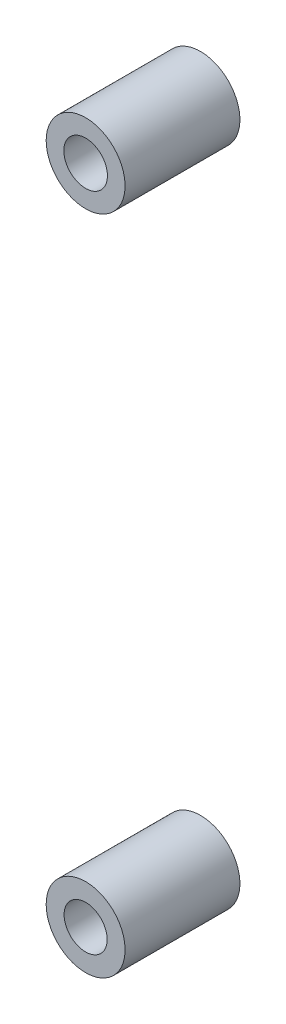
ISO-10303-21;
HEADER;
FILE_DESCRIPTION(('STEP AP214'),'2;1');
FILE_NAME('part.step','',(''),(''),'','','');
FILE_SCHEMA(('AUTOMOTIVE_DESIGN { 1 0 10303 214 1 1 1 1 }'));
ENDSEC;
DATA;
#1=APPLICATION_CONTEXT('core data for automotive mechanical design processes');
#2=APPLICATION_PROTOCOL_DEFINITION('international standard','automotive_design',2000,#1);
#3=PRODUCT_CONTEXT('',#1,'mechanical');
#4=PRODUCT('Part','Part','',(#3));
#5=PRODUCT_RELATED_PRODUCT_CATEGORY('part','',(#4));
#6=PRODUCT_DEFINITION_FORMATION('','',#4);
#7=PRODUCT_DEFINITION_CONTEXT('part definition',#1,'design');
#8=PRODUCT_DEFINITION('design','',#6,#7);
#9=PRODUCT_DEFINITION_SHAPE('','',#8);
#10=(LENGTH_UNIT() NAMED_UNIT(*) SI_UNIT(.MILLI.,.METRE.));
#11=(NAMED_UNIT(*) PLANE_ANGLE_UNIT() SI_UNIT($,.RADIAN.));
#12=(NAMED_UNIT(*) SI_UNIT($,.STERADIAN.) SOLID_ANGLE_UNIT());
#13=UNCERTAINTY_MEASURE_WITH_UNIT(LENGTH_MEASURE(1.E-05),#10,'distance_accuracy_value','');
#14=(GEOMETRIC_REPRESENTATION_CONTEXT(3) GLOBAL_UNCERTAINTY_ASSIGNED_CONTEXT((#13)) GLOBAL_UNIT_ASSIGNED_CONTEXT((#10,
#11,#12)) REPRESENTATION_CONTEXT('',''));
#15=CARTESIAN_POINT('',(0.,0.,0.));
#16=DIRECTION('',(0.,0.,1.));
#17=DIRECTION('',(1.,0.,0.));
#18=AXIS2_PLACEMENT_3D('',#15,#16,#17);
#19=CARTESIAN_POINT('',(-24.6984901117111,-24.5621520758186,-49.8004157799882));
#20=DIRECTION('',(0.,0.,-1.));
#21=DIRECTION('',(-1.,0.,0.));
#22=AXIS2_PLACEMENT_3D('',#19,#20,#21);
#23=PLANE('',#22);
#24=CARTESIAN_POINT('',(-24.6984901117111,-24.5621520758186,-49.8004157799882));
#25=DIRECTION('',(0.,0.,-1.));
#26=DIRECTION('',(-1.,0.,0.));
#27=AXIS2_PLACEMENT_3D('',#24,#25,#26);
#28=CIRCLE('',#27,2.75);
#29=CARTESIAN_POINT('',(-27.4484901117111,-24.5621520758186,-49.8004157799882));
#30=VERTEX_POINT('',#29);
#31=EDGE_CURVE('E11',#30,#30,#28,.T.);
#32=ORIENTED_EDGE('',*,*,#31,.T.);
#33=EDGE_LOOP('',(#32));
#34=FACE_BOUND('',#33,.T.);
#35=CARTESIAN_POINT('',(-24.6984901117111,-24.5621520758186,-49.8004157799882));
#36=DIRECTION('',(0.,0.,-1.));
#37=DIRECTION('',(-1.,0.,0.));
#38=AXIS2_PLACEMENT_3D('',#35,#36,#37);
#39=CIRCLE('',#38,1.49999999999862);
#40=CARTESIAN_POINT('',(-26.1984901117097,-24.5621520758186,-49.8004157799882));
#41=VERTEX_POINT('',#40);
#42=EDGE_CURVE('E56',#41,#41,#39,.T.);
#43=ORIENTED_EDGE('',*,*,#42,.F.);
#44=EDGE_LOOP('',(#43));
#45=FACE_BOUND('',#44,.T.);
#46=ADVANCED_FACE('F42',(#34,#45),#23,.T.);
#47=CARTESIAN_POINT('',(-24.6984901117111,-24.5621520758186,-41.8004157799882));
#48=DIRECTION('',(0.,0.,-1.));
#49=DIRECTION('',(-1.,0.,0.));
#50=AXIS2_PLACEMENT_3D('',#47,#48,#49);
#51=PLANE('',#50);
#52=CARTESIAN_POINT('',(-24.6984901117111,-24.5621520758186,-41.8004157799882));
#53=DIRECTION('',(0.,0.,-1.));
#54=DIRECTION('',(-1.,0.,0.));
#55=AXIS2_PLACEMENT_3D('',#52,#53,#54);
#56=CIRCLE('',#55,2.75);
#57=CARTESIAN_POINT('',(-27.4484901117111,-24.5621520758186,-41.8004157799882));
#58=VERTEX_POINT('',#57);
#59=EDGE_CURVE('E46',#58,#58,#56,.T.);
#60=ORIENTED_EDGE('',*,*,#59,.F.);
#61=EDGE_LOOP('',(#60));
#62=FACE_BOUND('',#61,.T.);
#63=CARTESIAN_POINT('',(-24.6984901117111,-24.5621520758186,-41.8004157799882));
#64=DIRECTION('',(0.,0.,-1.));
#65=DIRECTION('',(-1.,0.,0.));
#66=AXIS2_PLACEMENT_3D('',#63,#64,#65);
#67=CIRCLE('',#66,1.49999999999862);
#68=CARTESIAN_POINT('',(-26.1984901117097,-24.5621520758186,-41.8004157799882));
#69=VERTEX_POINT('',#68);
#70=EDGE_CURVE('E58',#69,#69,#67,.T.);
#71=ORIENTED_EDGE('',*,*,#70,.T.);
#72=EDGE_LOOP('',(#71));
#73=FACE_BOUND('',#72,.T.);
#74=ADVANCED_FACE('F69',(#62,#73),#51,.F.);
#75=CARTESIAN_POINT('',(-24.6984901117111,-24.5621520758186,-49.8004157799882));
#76=DIRECTION('',(0.,0.,1.));
#77=DIRECTION('',(1.,0.,0.));
#78=AXIS2_PLACEMENT_3D('',#75,#76,#77);
#79=CYLINDRICAL_SURFACE('',#78,2.75);
#80=ORIENTED_EDGE('',*,*,#31,.F.);
#81=EDGE_LOOP('',(#80));
#82=FACE_BOUND('',#81,.T.);
#83=ORIENTED_EDGE('',*,*,#59,.T.);
#84=EDGE_LOOP('',(#83));
#85=FACE_BOUND('',#84,.T.);
#86=ADVANCED_FACE('F44',(#82,#85),#79,.T.);
#87=CARTESIAN_POINT('',(-24.6984901117111,-24.5621520758186,-49.8004157799882));
#88=DIRECTION('',(0.,0.,1.));
#89=DIRECTION('',(1.,0.,0.));
#90=AXIS2_PLACEMENT_3D('',#87,#88,#89);
#91=CYLINDRICAL_SURFACE('',#90,1.49999999999862);
#92=ORIENTED_EDGE('',*,*,#42,.T.);
#93=EDGE_LOOP('',(#92));
#94=FACE_BOUND('',#93,.T.);
#95=ORIENTED_EDGE('',*,*,#70,.F.);
#96=EDGE_LOOP('',(#95));
#97=FACE_BOUND('',#96,.T.);
#98=ADVANCED_FACE('F65',(#94,#97),#91,.F.);
#99=CLOSED_SHELL('',(#46,#74,#86,#98));
#100=MANIFOLD_SOLID_BREP('B2',#99);
#101=CARTESIAN_POINT('',(-24.6984901117111,21.5378471641813,-49.8004157799882));
#102=DIRECTION('',(0.,0.,-1.));
#103=DIRECTION('',(-1.,0.,0.));
#104=AXIS2_PLACEMENT_3D('',#101,#102,#103);
#105=PLANE('',#104);
#106=CARTESIAN_POINT('',(-24.6984901117111,21.5378471641813,-49.8004157799882));
#107=DIRECTION('',(0.,0.,-1.));
#108=DIRECTION('',(-1.,0.,0.));
#109=AXIS2_PLACEMENT_3D('',#106,#107,#108);
#110=CIRCLE('',#109,2.75000000000041);
#111=CARTESIAN_POINT('',(-27.4484901117115,21.5378471641813,-49.8004157799882));
#112=VERTEX_POINT('',#111);
#113=EDGE_CURVE('E41',#112,#112,#110,.T.);
#114=ORIENTED_EDGE('',*,*,#113,.T.);
#115=EDGE_LOOP('',(#114));
#116=FACE_BOUND('',#115,.T.);
#117=CARTESIAN_POINT('',(-24.6984901117111,21.5378471641813,-49.8004157799882));
#118=DIRECTION('',(0.,0.,-1.));
#119=DIRECTION('',(-1.,0.,0.));
#120=AXIS2_PLACEMENT_3D('',#117,#118,#119);
#121=CIRCLE('',#120,1.52);
#122=CARTESIAN_POINT('',(-26.2184901117111,21.5378471641813,-49.8004157799882));
#123=VERTEX_POINT('',#122);
#124=EDGE_CURVE('E126',#123,#123,#121,.T.);
#125=ORIENTED_EDGE('',*,*,#124,.F.);
#126=EDGE_LOOP('',(#125));
#127=FACE_BOUND('',#126,.T.);
#128=ADVANCED_FACE('F111',(#116,#127),#105,.T.);
#129=CARTESIAN_POINT('',(-24.6984901117111,21.5378471641813,-41.8004157799882));
#130=DIRECTION('',(0.,0.,-1.));
#131=DIRECTION('',(-1.,0.,0.));
#132=AXIS2_PLACEMENT_3D('',#129,#130,#131);
#133=PLANE('',#132);
#134=CARTESIAN_POINT('',(-24.6984901117111,21.5378471641813,-41.8004157799882));
#135=DIRECTION('',(0.,0.,-1.));
#136=DIRECTION('',(-1.,0.,0.));
#137=AXIS2_PLACEMENT_3D('',#134,#135,#136);
#138=CIRCLE('',#137,2.75000000000041);
#139=CARTESIAN_POINT('',(-27.4484901117115,21.5378471641813,-41.8004157799882));
#140=VERTEX_POINT('',#139);
#141=EDGE_CURVE('E115',#140,#140,#138,.T.);
#142=ORIENTED_EDGE('',*,*,#141,.F.);
#143=EDGE_LOOP('',(#142));
#144=FACE_BOUND('',#143,.T.);
#145=CARTESIAN_POINT('',(-24.6984901117111,21.5378471641813,-41.8004157799882));
#146=DIRECTION('',(0.,0.,-1.));
#147=DIRECTION('',(-1.,0.,0.));
#148=AXIS2_PLACEMENT_3D('',#145,#146,#147);
#149=CIRCLE('',#148,1.52);
#150=CARTESIAN_POINT('',(-26.2184901117111,21.5378471641813,-41.8004157799882));
#151=VERTEX_POINT('',#150);
#152=EDGE_CURVE('E128',#151,#151,#149,.T.);
#153=ORIENTED_EDGE('',*,*,#152,.T.);
#154=EDGE_LOOP('',(#153));
#155=FACE_BOUND('',#154,.T.);
#156=ADVANCED_FACE('F138',(#144,#155),#133,.F.);
#157=CARTESIAN_POINT('',(-24.6984901117111,21.5378471641813,-49.8004157799882));
#158=DIRECTION('',(0.,0.,1.));
#159=DIRECTION('',(1.,0.,0.));
#160=AXIS2_PLACEMENT_3D('',#157,#158,#159);
#161=CYLINDRICAL_SURFACE('',#160,2.75000000000041);
#162=ORIENTED_EDGE('',*,*,#113,.F.);
#163=EDGE_LOOP('',(#162));
#164=FACE_BOUND('',#163,.T.);
#165=ORIENTED_EDGE('',*,*,#141,.T.);
#166=EDGE_LOOP('',(#165));
#167=FACE_BOUND('',#166,.T.);
#168=ADVANCED_FACE('F113',(#164,#167),#161,.T.);
#169=CARTESIAN_POINT('',(-24.6984901117111,21.5378471641813,-49.8004157799882));
#170=DIRECTION('',(0.,0.,1.));
#171=DIRECTION('',(1.,0.,0.));
#172=AXIS2_PLACEMENT_3D('',#169,#170,#171);
#173=CYLINDRICAL_SURFACE('',#172,1.52);
#174=ORIENTED_EDGE('',*,*,#124,.T.);
#175=EDGE_LOOP('',(#174));
#176=FACE_BOUND('',#175,.T.);
#177=ORIENTED_EDGE('',*,*,#152,.F.);
#178=EDGE_LOOP('',(#177));
#179=FACE_BOUND('',#178,.T.);
#180=ADVANCED_FACE('F134',(#176,#179),#173,.F.);
#181=CLOSED_SHELL('',(#128,#156,#168,#180));
#182=MANIFOLD_SOLID_BREP('B6',#181);
#183=ADVANCED_BREP_SHAPE_REPRESENTATION('',(#18,#100,#182),#14);
#184=SHAPE_DEFINITION_REPRESENTATION(#9,#183);
ENDSEC;
END-ISO-10303-21;
